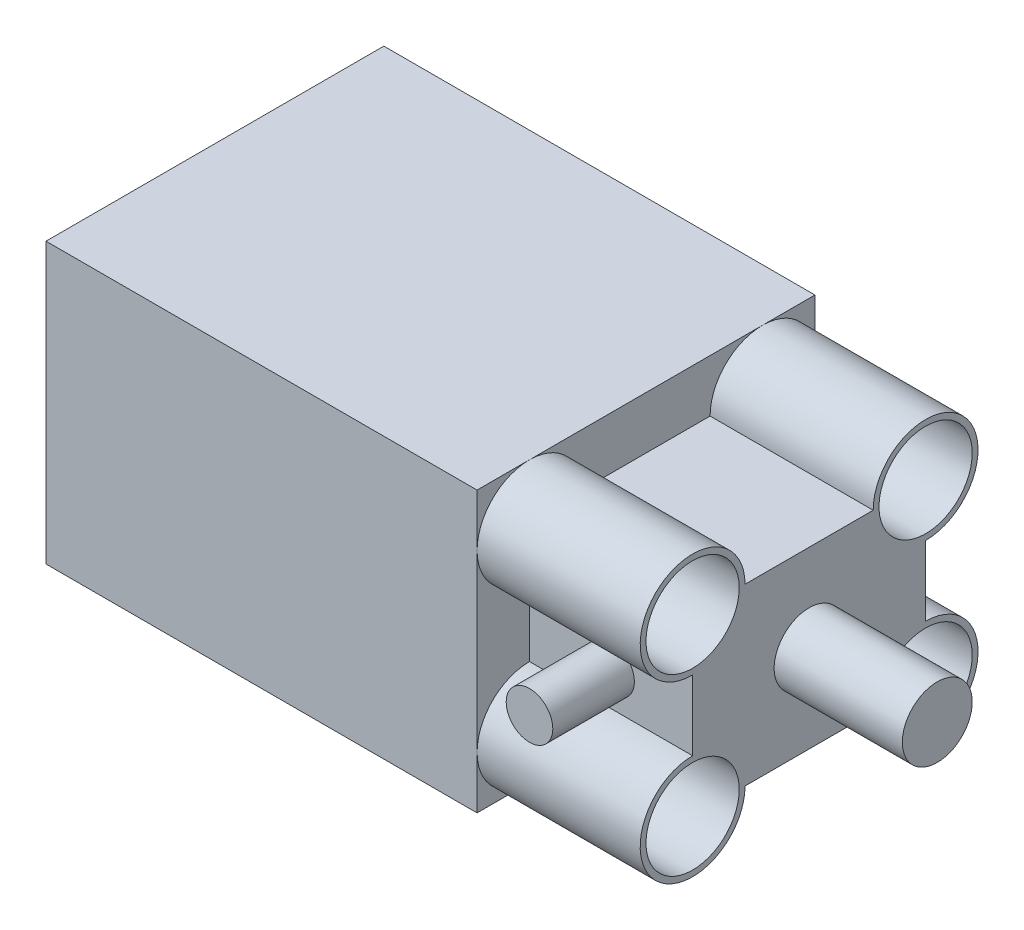
ISO-10303-21;
HEADER;
FILE_DESCRIPTION(('STEP AP214'),'2;1');
FILE_NAME('part.step','',(''),(''),'','','');
FILE_SCHEMA(('AUTOMOTIVE_DESIGN { 1 0 10303 214 1 1 1 1 }'));
ENDSEC;
DATA;
#1=APPLICATION_CONTEXT('core data for automotive mechanical design processes');
#2=APPLICATION_PROTOCOL_DEFINITION('international standard','automotive_design',2000,#1);
#3=PRODUCT_CONTEXT('',#1,'mechanical');
#4=PRODUCT('Part','Part','',(#3));
#5=PRODUCT_RELATED_PRODUCT_CATEGORY('part','',(#4));
#6=PRODUCT_DEFINITION_FORMATION('','',#4);
#7=PRODUCT_DEFINITION_CONTEXT('part definition',#1,'design');
#8=PRODUCT_DEFINITION('design','',#6,#7);
#9=PRODUCT_DEFINITION_SHAPE('','',#8);
#10=(LENGTH_UNIT() NAMED_UNIT(*) SI_UNIT(.MILLI.,.METRE.));
#11=(NAMED_UNIT(*) PLANE_ANGLE_UNIT() SI_UNIT($,.RADIAN.));
#12=(NAMED_UNIT(*) SI_UNIT($,.STERADIAN.) SOLID_ANGLE_UNIT());
#13=UNCERTAINTY_MEASURE_WITH_UNIT(LENGTH_MEASURE(1.E-05),#10,'distance_accuracy_value','');
#14=(GEOMETRIC_REPRESENTATION_CONTEXT(3) GLOBAL_UNCERTAINTY_ASSIGNED_CONTEXT((#13)) GLOBAL_UNIT_ASSIGNED_CONTEXT((#10,
#11,#12)) REPRESENTATION_CONTEXT('',''));
#15=CARTESIAN_POINT('',(0.,0.,0.));
#16=DIRECTION('',(0.,0.,1.));
#17=DIRECTION('',(1.,0.,0.));
#18=AXIS2_PLACEMENT_3D('',#15,#16,#17);
#19=CARTESIAN_POINT('',(9.25,12.,-7.25));
#20=DIRECTION('',(-1.,0.,0.));
#21=DIRECTION('',(0.,0.,1.));
#22=AXIS2_PLACEMENT_3D('',#19,#20,#21);
#23=PLANE('',#22);
#24=CARTESIAN_POINT('',(9.25,2.25,-5.));
#25=DIRECTION('',(1.,0.,0.));
#26=DIRECTION('',(0.,0.,-1.));
#27=AXIS2_PLACEMENT_3D('',#24,#25,#26);
#28=CIRCLE('',#27,2.25);
#29=CARTESIAN_POINT('',(9.25,2.25,-7.25));
#30=VERTEX_POINT('',#29);
#31=CARTESIAN_POINT('',(9.25,4.5,-5.));
#32=VERTEX_POINT('',#31);
#33=EDGE_CURVE('E45',#30,#32,#28,.T.);
#34=ORIENTED_EDGE('',*,*,#33,.F.);
#35=DIRECTION('',(0.,-1.,0.));
#36=VECTOR('',#35,1.);
#37=CARTESIAN_POINT('',(9.25,12.,-7.25));
#38=LINE('',#37,#36);
#39=CARTESIAN_POINT('',(9.25,9.75,-7.25));
#40=VERTEX_POINT('',#39);
#41=EDGE_CURVE('E216',#40,#30,#38,.T.);
#42=ORIENTED_EDGE('',*,*,#41,.F.);
#43=CARTESIAN_POINT('',(9.25,9.75,-5.));
#44=DIRECTION('',(1.,0.,0.));
#45=DIRECTION('',(0.,0.,-1.));
#46=AXIS2_PLACEMENT_3D('',#43,#44,#45);
#47=CIRCLE('',#46,2.25);
#48=CARTESIAN_POINT('',(9.25,7.5,-5.));
#49=VERTEX_POINT('',#48);
#50=EDGE_CURVE('E57',#49,#40,#47,.T.);
#51=ORIENTED_EDGE('',*,*,#50,.F.);
#52=DIRECTION('',(0.,-1.,0.));
#53=VECTOR('',#52,1.);
#54=CARTESIAN_POINT('',(9.25,0.,-5.));
#55=LINE('',#54,#53);
#56=EDGE_CURVE('E52',#49,#32,#55,.T.);
#57=ORIENTED_EDGE('',*,*,#56,.T.);
#58=EDGE_LOOP('',(#34,#42,#51,#57));
#59=FACE_BOUND('',#58,.T.);
#60=ADVANCED_FACE('F37',(#59),#23,.F.);
#61=CARTESIAN_POINT('',(9.25,0.,-5.));
#62=VERTEX_POINT('',#61);
#63=EDGE_CURVE('E364',#62,#30,#28,.T.);
#64=ORIENTED_EDGE('',*,*,#63,.F.);
#65=DIRECTION('',(0.,0.,-1.));
#66=VECTOR('',#65,1.);
#67=CARTESIAN_POINT('',(9.25,0.,-7.25));
#68=LINE('',#67,#66);
#69=CARTESIAN_POINT('',(9.25,0.,-7.25));
#70=VERTEX_POINT('',#69);
#71=EDGE_CURVE('E203',#62,#70,#68,.T.);
#72=ORIENTED_EDGE('',*,*,#71,.T.);
#73=EDGE_CURVE('E211',#30,#70,#38,.T.);
#74=ORIENTED_EDGE('',*,*,#73,.F.);
#75=EDGE_LOOP('',(#64,#72,#74));
#76=FACE_BOUND('',#75,.T.);
#77=ADVANCED_FACE('F294',(#76),#23,.F.);
#78=CARTESIAN_POINT('',(9.25,12.,-5.));
#79=VERTEX_POINT('',#78);
#80=EDGE_CURVE('E369',#40,#79,#47,.T.);
#81=ORIENTED_EDGE('',*,*,#80,.F.);
#82=CARTESIAN_POINT('',(9.25,12.,-7.25));
#83=VERTEX_POINT('',#82);
#84=EDGE_CURVE('E212',#83,#40,#38,.T.);
#85=ORIENTED_EDGE('',*,*,#84,.F.);
#86=DIRECTION('',(0.,0.,-1.));
#87=VECTOR('',#86,1.);
#88=CARTESIAN_POINT('',(9.25,12.,-7.25));
#89=LINE('',#88,#87);
#90=EDGE_CURVE('E193',#79,#83,#89,.T.);
#91=ORIENTED_EDGE('',*,*,#90,.F.);
#92=EDGE_LOOP('',(#81,#85,#91));
#93=FACE_BOUND('',#92,.T.);
#94=ADVANCED_FACE('F300',(#93),#23,.F.);
#95=CARTESIAN_POINT('',(9.25,9.75,-2.75));
#96=VERTEX_POINT('',#95);
#97=EDGE_CURVE('E356',#79,#96,#47,.T.);
#98=ORIENTED_EDGE('',*,*,#97,.F.);
#99=CARTESIAN_POINT('',(9.25,12.,5.));
#100=VERTEX_POINT('',#99);
#101=EDGE_CURVE('E198',#100,#79,#89,.T.);
#102=ORIENTED_EDGE('',*,*,#101,.F.);
#103=CARTESIAN_POINT('',(9.25,9.75,5.));
#104=DIRECTION('',(1.,0.,0.));
#105=DIRECTION('',(0.,0.,-1.));
#106=AXIS2_PLACEMENT_3D('',#103,#104,#105);
#107=CIRCLE('',#106,2.25);
#108=CARTESIAN_POINT('',(9.25,9.75,2.75));
#109=VERTEX_POINT('',#108);
#110=EDGE_CURVE('E226',#109,#100,#107,.T.);
#111=ORIENTED_EDGE('',*,*,#110,.F.);
#112=DIRECTION('',(0.,0.,-1.));
#113=VECTOR('',#112,1.);
#114=CARTESIAN_POINT('',(9.25,9.75,0.));
#115=LINE('',#114,#113);
#116=EDGE_CURVE('E368',#109,#96,#115,.T.);
#117=ORIENTED_EDGE('',*,*,#116,.T.);
#118=EDGE_LOOP('',(#98,#102,#111,#117));
#119=FACE_BOUND('',#118,.T.);
#120=ADVANCED_FACE('F409',(#119),#23,.F.);
#121=CARTESIAN_POINT('',(9.25,2.25,-2.75));
#122=VERTEX_POINT('',#121);
#123=EDGE_CURVE('E359',#122,#62,#28,.T.);
#124=ORIENTED_EDGE('',*,*,#123,.F.);
#125=DIRECTION('',(0.,0.,1.));
#126=VECTOR('',#125,1.);
#127=CARTESIAN_POINT('',(9.25,2.25,0.));
#128=LINE('',#127,#126);
#129=CARTESIAN_POINT('',(9.25,2.25,2.75));
#130=VERTEX_POINT('',#129);
#131=EDGE_CURVE('E358',#122,#130,#128,.T.);
#132=ORIENTED_EDGE('',*,*,#131,.T.);
#133=CARTESIAN_POINT('',(9.25,2.25,5.));
#134=DIRECTION('',(1.,0.,0.));
#135=DIRECTION('',(0.,0.,-1.));
#136=AXIS2_PLACEMENT_3D('',#133,#134,#135);
#137=CIRCLE('',#136,2.25);
#138=CARTESIAN_POINT('',(9.25,0.,5.));
#139=VERTEX_POINT('',#138);
#140=EDGE_CURVE('E353',#139,#130,#137,.T.);
#141=ORIENTED_EDGE('',*,*,#140,.F.);
#142=EDGE_CURVE('E207',#139,#62,#68,.T.);
#143=ORIENTED_EDGE('',*,*,#142,.T.);
#144=EDGE_LOOP('',(#124,#132,#141,#143));
#145=FACE_BOUND('',#144,.T.);
#146=ADVANCED_FACE('F416',(#145),#23,.F.);
#147=CARTESIAN_POINT('',(9.25,2.25,7.25));
#148=VERTEX_POINT('',#147);
#149=EDGE_CURVE('E227',#148,#139,#137,.T.);
#150=ORIENTED_EDGE('',*,*,#149,.F.);
#151=DIRECTION('',(0.,-1.,0.));
#152=VECTOR('',#151,1.);
#153=CARTESIAN_POINT('',(9.25,12.,7.25));
#154=LINE('',#153,#152);
#155=CARTESIAN_POINT('',(9.25,0.,7.25));
#156=VERTEX_POINT('',#155);
#157=EDGE_CURVE('E215',#148,#156,#154,.T.);
#158=ORIENTED_EDGE('',*,*,#157,.T.);
#159=EDGE_CURVE('E204',#156,#139,#68,.T.);
#160=ORIENTED_EDGE('',*,*,#159,.T.);
#161=EDGE_LOOP('',(#150,#158,#160));
#162=FACE_BOUND('',#161,.T.);
#163=ADVANCED_FACE('F350',(#162),#23,.F.);
#164=CARTESIAN_POINT('',(9.25,9.75,7.25));
#165=VERTEX_POINT('',#164);
#166=EDGE_CURVE('E224',#100,#165,#107,.T.);
#167=ORIENTED_EDGE('',*,*,#166,.F.);
#168=CARTESIAN_POINT('',(9.25,12.,7.25));
#169=VERTEX_POINT('',#168);
#170=EDGE_CURVE('E194',#169,#100,#89,.T.);
#171=ORIENTED_EDGE('',*,*,#170,.F.);
#172=EDGE_CURVE('E217',#169,#165,#154,.T.);
#173=ORIENTED_EDGE('',*,*,#172,.T.);
#174=EDGE_LOOP('',(#167,#171,#173));
#175=FACE_BOUND('',#174,.T.);
#176=ADVANCED_FACE('F315',(#175),#23,.F.);
#177=CARTESIAN_POINT('',(-9.25,12.,-7.25));
#178=DIRECTION('',(1.,0.,0.));
#179=DIRECTION('',(0.,0.,-1.));
#180=AXIS2_PLACEMENT_3D('',#177,#178,#179);
#181=PLANE('',#180);
#182=DIRECTION('',(0.,0.,1.));
#183=VECTOR('',#182,1.);
#184=CARTESIAN_POINT('',(-9.25,0.,-7.25));
#185=LINE('',#184,#183);
#186=CARTESIAN_POINT('',(-9.25,0.,-7.25));
#187=VERTEX_POINT('',#186);
#188=CARTESIAN_POINT('',(-9.25,0.,7.25));
#189=VERTEX_POINT('',#188);
#190=EDGE_CURVE('E178',#187,#189,#185,.T.);
#191=ORIENTED_EDGE('',*,*,#190,.T.);
#192=DIRECTION('',(0.,-1.,0.));
#193=VECTOR('',#192,1.);
#194=CARTESIAN_POINT('',(-9.25,12.,7.25));
#195=LINE('',#194,#193);
#196=CARTESIAN_POINT('',(-9.25,12.,7.25));
#197=VERTEX_POINT('',#196);
#198=EDGE_CURVE('E219',#197,#189,#195,.T.);
#199=ORIENTED_EDGE('',*,*,#198,.F.);
#200=DIRECTION('',(0.,0.,1.));
#201=VECTOR('',#200,1.);
#202=CARTESIAN_POINT('',(-9.25,12.,-7.25));
#203=LINE('',#202,#201);
#204=CARTESIAN_POINT('',(-9.25,12.,-7.25));
#205=VERTEX_POINT('',#204);
#206=EDGE_CURVE('E187',#205,#197,#203,.T.);
#207=ORIENTED_EDGE('',*,*,#206,.F.);
#208=DIRECTION('',(0.,-1.,0.));
#209=VECTOR('',#208,1.);
#210=CARTESIAN_POINT('',(-9.25,12.,-7.25));
#211=LINE('',#210,#209);
#212=EDGE_CURVE('E199',#205,#187,#211,.T.);
#213=ORIENTED_EDGE('',*,*,#212,.T.);
#214=EDGE_LOOP('',(#191,#199,#207,#213));
#215=FACE_BOUND('',#214,.T.);
#216=ADVANCED_FACE('F39',(#215),#181,.F.);
#217=CARTESIAN_POINT('',(9.25,12.,7.25));
#218=DIRECTION('',(0.,0.,-1.));
#219=DIRECTION('',(-1.,0.,0.));
#220=AXIS2_PLACEMENT_3D('',#217,#218,#219);
#221=PLANE('',#220);
#222=DIRECTION('',(1.,0.,0.));
#223=VECTOR('',#222,1.);
#224=CARTESIAN_POINT('',(9.25,0.,7.25));
#225=LINE('',#224,#223);
#226=EDGE_CURVE('E181',#189,#156,#225,.T.);
#227=ORIENTED_EDGE('',*,*,#226,.T.);
#228=ORIENTED_EDGE('',*,*,#157,.F.);
#229=EDGE_CURVE('E220',#165,#148,#154,.T.);
#230=ORIENTED_EDGE('',*,*,#229,.F.);
#231=ORIENTED_EDGE('',*,*,#172,.F.);
#232=DIRECTION('',(1.,0.,0.));
#233=VECTOR('',#232,1.);
#234=CARTESIAN_POINT('',(9.25,12.,7.25));
#235=LINE('',#234,#233);
#236=EDGE_CURVE('E190',#197,#169,#235,.T.);
#237=ORIENTED_EDGE('',*,*,#236,.F.);
#238=ORIENTED_EDGE('',*,*,#198,.T.);
#239=EDGE_LOOP('',(#227,#228,#230,#231,#237,#238));
#240=FACE_BOUND('',#239,.T.);
#241=ADVANCED_FACE('F318',(#240),#221,.F.);
#242=CARTESIAN_POINT('',(9.25,7.5,5.));
#243=VERTEX_POINT('',#242);
#244=EDGE_CURVE('E177',#165,#243,#107,.T.);
#245=ORIENTED_EDGE('',*,*,#244,.F.);
#246=ORIENTED_EDGE('',*,*,#229,.T.);
#247=CARTESIAN_POINT('',(9.25,4.5,5.));
#248=VERTEX_POINT('',#247);
#249=EDGE_CURVE('E232',#248,#148,#137,.T.);
#250=ORIENTED_EDGE('',*,*,#249,.F.);
#251=DIRECTION('',(0.,-1.,0.));
#252=VECTOR('',#251,1.);
#253=CARTESIAN_POINT('',(9.25,0.,5.));
#254=LINE('',#253,#252);
#255=EDGE_CURVE('E230',#243,#248,#254,.T.);
#256=ORIENTED_EDGE('',*,*,#255,.F.);
#257=EDGE_LOOP('',(#245,#246,#250,#256));
#258=FACE_BOUND('',#257,.T.);
#259=ADVANCED_FACE('F302',(#258),#23,.F.);
#260=CARTESIAN_POINT('',(9.25,12.,-7.25));
#261=DIRECTION('',(0.,0.,1.));
#262=DIRECTION('',(1.,0.,0.));
#263=AXIS2_PLACEMENT_3D('',#260,#261,#262);
#264=PLANE('',#263);
#265=DIRECTION('',(-1.,0.,0.));
#266=VECTOR('',#265,1.);
#267=CARTESIAN_POINT('',(9.25,0.,-7.25));
#268=LINE('',#267,#266);
#269=EDGE_CURVE('E191',#70,#187,#268,.T.);
#270=ORIENTED_EDGE('',*,*,#269,.T.);
#271=ORIENTED_EDGE('',*,*,#212,.F.);
#272=DIRECTION('',(-1.,0.,0.));
#273=VECTOR('',#272,1.);
#274=CARTESIAN_POINT('',(9.25,12.,-7.25));
#275=LINE('',#274,#273);
#276=EDGE_CURVE('E197',#83,#205,#275,.T.);
#277=ORIENTED_EDGE('',*,*,#276,.F.);
#278=ORIENTED_EDGE('',*,*,#84,.T.);
#279=ORIENTED_EDGE('',*,*,#41,.T.);
#280=ORIENTED_EDGE('',*,*,#73,.T.);
#281=EDGE_LOOP('',(#270,#271,#277,#278,#279,#280));
#282=FACE_BOUND('',#281,.T.);
#283=ADVANCED_FACE('F317',(#282),#264,.F.);
#284=CARTESIAN_POINT('',(0.,12.,0.));
#285=DIRECTION('',(0.,-1.,0.));
#286=DIRECTION('',(0.,0.,-1.));
#287=AXIS2_PLACEMENT_3D('',#284,#285,#286);
#288=PLANE('',#287);
#289=ORIENTED_EDGE('',*,*,#206,.T.);
#290=ORIENTED_EDGE('',*,*,#236,.T.);
#291=ORIENTED_EDGE('',*,*,#170,.T.);
#292=ORIENTED_EDGE('',*,*,#101,.T.);
#293=ORIENTED_EDGE('',*,*,#90,.T.);
#294=ORIENTED_EDGE('',*,*,#276,.T.);
#295=EDGE_LOOP('',(#289,#290,#291,#292,#293,#294));
#296=FACE_BOUND('',#295,.T.);
#297=ADVANCED_FACE('F324',(#296),#288,.F.);
#298=CARTESIAN_POINT('',(0.,0.,0.));
#299=DIRECTION('',(0.,-1.,0.));
#300=DIRECTION('',(0.,0.,-1.));
#301=AXIS2_PLACEMENT_3D('',#298,#299,#300);
#302=PLANE('',#301);
#303=ORIENTED_EDGE('',*,*,#190,.F.);
#304=ORIENTED_EDGE('',*,*,#269,.F.);
#305=ORIENTED_EDGE('',*,*,#71,.F.);
#306=ORIENTED_EDGE('',*,*,#142,.F.);
#307=ORIENTED_EDGE('',*,*,#159,.F.);
#308=ORIENTED_EDGE('',*,*,#226,.F.);
#309=EDGE_LOOP('',(#303,#304,#305,#306,#307,#308));
#310=FACE_BOUND('',#309,.T.);
#311=ADVANCED_FACE('F291',(#310),#302,.T.);
#312=CARTESIAN_POINT('',(16.25,9.75,5.));
#313=DIRECTION('',(-1.,0.,0.));
#314=DIRECTION('',(0.,0.,1.));
#315=AXIS2_PLACEMENT_3D('',#312,#313,#314);
#316=CYLINDRICAL_SURFACE('',#315,2.25);
#317=ORIENTED_EDGE('',*,*,#110,.T.);
#318=ORIENTED_EDGE('',*,*,#166,.T.);
#319=ORIENTED_EDGE('',*,*,#244,.T.);
#320=DIRECTION('',(-1.,0.,0.));
#321=VECTOR('',#320,1.);
#322=CARTESIAN_POINT('',(16.25,7.5,5.));
#323=LINE('',#322,#321);
#324=CARTESIAN_POINT('',(16.25,7.5,5.));
#325=VERTEX_POINT('',#324);
#326=EDGE_CURVE('E155',#325,#243,#323,.T.);
#327=ORIENTED_EDGE('',*,*,#326,.F.);
#328=CARTESIAN_POINT('',(16.25,9.75,5.));
#329=DIRECTION('',(1.,0.,0.));
#330=DIRECTION('',(0.,0.,-1.));
#331=AXIS2_PLACEMENT_3D('',#328,#329,#330);
#332=CIRCLE('',#331,2.25);
#333=CARTESIAN_POINT('',(16.25,9.75,2.75));
#334=VERTEX_POINT('',#333);
#335=EDGE_CURVE('E161',#334,#325,#332,.T.);
#336=ORIENTED_EDGE('',*,*,#335,.F.);
#337=DIRECTION('',(-1.,0.,0.));
#338=VECTOR('',#337,1.);
#339=CARTESIAN_POINT('',(16.25,9.75,2.75));
#340=LINE('',#339,#338);
#341=EDGE_CURVE('E244',#334,#109,#340,.T.);
#342=ORIENTED_EDGE('',*,*,#341,.T.);
#343=EDGE_LOOP('',(#317,#318,#319,#327,#336,#342));
#344=FACE_BOUND('',#343,.T.);
#345=ADVANCED_FACE('F175',(#344),#316,.T.);
#346=CARTESIAN_POINT('',(16.25,0.,5.));
#347=DIRECTION('',(0.,0.,-1.));
#348=DIRECTION('',(-1.,0.,0.));
#349=AXIS2_PLACEMENT_3D('',#346,#347,#348);
#350=PLANE('',#349);
#351=CARTESIAN_POINT('',(12.75,6.,5.));
#352=DIRECTION('',(0.,0.,-1.));
#353=DIRECTION('',(-1.,0.,0.));
#354=AXIS2_PLACEMENT_3D('',#351,#352,#353);
#355=CIRCLE('',#354,1.);
#356=CARTESIAN_POINT('',(11.75,6.,5.));
#357=VERTEX_POINT('',#356);
#358=EDGE_CURVE('E11',#357,#357,#355,.F.);
#359=ORIENTED_EDGE('',*,*,#358,.F.);
#360=EDGE_LOOP('',(#359));
#361=FACE_BOUND('',#360,.T.);
#362=ORIENTED_EDGE('',*,*,#255,.T.);
#363=DIRECTION('',(-1.,0.,0.));
#364=VECTOR('',#363,1.);
#365=CARTESIAN_POINT('',(16.25,4.5,5.));
#366=LINE('',#365,#364);
#367=CARTESIAN_POINT('',(16.25,4.5,5.));
#368=VERTEX_POINT('',#367);
#369=EDGE_CURVE('E157',#368,#248,#366,.T.);
#370=ORIENTED_EDGE('',*,*,#369,.F.);
#371=DIRECTION('',(0.,-1.,0.));
#372=VECTOR('',#371,1.);
#373=CARTESIAN_POINT('',(16.25,0.,5.));
#374=LINE('',#373,#372);
#375=EDGE_CURVE('E150',#325,#368,#374,.T.);
#376=ORIENTED_EDGE('',*,*,#375,.F.);
#377=ORIENTED_EDGE('',*,*,#326,.T.);
#378=EDGE_LOOP('',(#362,#370,#376,#377));
#379=FACE_BOUND('',#378,.T.);
#380=ADVANCED_FACE('F153',(#361,#379),#350,.F.);
#381=CARTESIAN_POINT('',(16.25,2.25,5.));
#382=DIRECTION('',(-1.,0.,0.));
#383=DIRECTION('',(0.,0.,1.));
#384=AXIS2_PLACEMENT_3D('',#381,#382,#383);
#385=CYLINDRICAL_SURFACE('',#384,2.25);
#386=ORIENTED_EDGE('',*,*,#249,.T.);
#387=ORIENTED_EDGE('',*,*,#149,.T.);
#388=ORIENTED_EDGE('',*,*,#140,.T.);
#389=DIRECTION('',(-1.,0.,0.));
#390=VECTOR('',#389,1.);
#391=CARTESIAN_POINT('',(16.25,2.25,2.75));
#392=LINE('',#391,#390);
#393=CARTESIAN_POINT('',(16.25,2.25,2.75));
#394=VERTEX_POINT('',#393);
#395=EDGE_CURVE('E183',#394,#130,#392,.T.);
#396=ORIENTED_EDGE('',*,*,#395,.F.);
#397=CARTESIAN_POINT('',(16.25,2.25,5.));
#398=DIRECTION('',(1.,0.,0.));
#399=DIRECTION('',(0.,0.,-1.));
#400=AXIS2_PLACEMENT_3D('',#397,#398,#399);
#401=CIRCLE('',#400,2.25);
#402=EDGE_CURVE('E160',#368,#394,#401,.T.);
#403=ORIENTED_EDGE('',*,*,#402,.F.);
#404=ORIENTED_EDGE('',*,*,#369,.T.);
#405=EDGE_LOOP('',(#386,#387,#388,#396,#403,#404));
#406=FACE_BOUND('',#405,.T.);
#407=ADVANCED_FACE('F282',(#406),#385,.T.);
#408=CARTESIAN_POINT('',(16.25,2.25,0.));
#409=DIRECTION('',(0.,-1.,0.));
#410=DIRECTION('',(0.,0.,-1.));
#411=AXIS2_PLACEMENT_3D('',#408,#409,#410);
#412=PLANE('',#411);
#413=ORIENTED_EDGE('',*,*,#131,.F.);
#414=DIRECTION('',(-1.,0.,0.));
#415=VECTOR('',#414,1.);
#416=CARTESIAN_POINT('',(16.25,2.25,-2.75));
#417=LINE('',#416,#415);
#418=CARTESIAN_POINT('',(16.25,2.25,-2.75));
#419=VERTEX_POINT('',#418);
#420=EDGE_CURVE('E388',#419,#122,#417,.T.);
#421=ORIENTED_EDGE('',*,*,#420,.F.);
#422=DIRECTION('',(0.,0.,1.));
#423=VECTOR('',#422,1.);
#424=CARTESIAN_POINT('',(16.25,2.25,0.));
#425=LINE('',#424,#423);
#426=EDGE_CURVE('E259',#419,#394,#425,.T.);
#427=ORIENTED_EDGE('',*,*,#426,.T.);
#428=ORIENTED_EDGE('',*,*,#395,.T.);
#429=EDGE_LOOP('',(#413,#421,#427,#428));
#430=FACE_BOUND('',#429,.T.);
#431=ADVANCED_FACE('F288',(#430),#412,.T.);
#432=CARTESIAN_POINT('',(16.25,2.25,-5.));
#433=DIRECTION('',(-1.,0.,0.));
#434=DIRECTION('',(0.,0.,1.));
#435=AXIS2_PLACEMENT_3D('',#432,#433,#434);
#436=CYLINDRICAL_SURFACE('',#435,2.25);
#437=ORIENTED_EDGE('',*,*,#123,.T.);
#438=ORIENTED_EDGE('',*,*,#63,.T.);
#439=ORIENTED_EDGE('',*,*,#33,.T.);
#440=DIRECTION('',(-1.,0.,0.));
#441=VECTOR('',#440,1.);
#442=CARTESIAN_POINT('',(16.25,4.5,-5.));
#443=LINE('',#442,#441);
#444=CARTESIAN_POINT('',(16.25,4.5,-5.));
#445=VERTEX_POINT('',#444);
#446=EDGE_CURVE('E385',#445,#32,#443,.T.);
#447=ORIENTED_EDGE('',*,*,#446,.F.);
#448=CARTESIAN_POINT('',(16.25,2.25,-5.));
#449=DIRECTION('',(1.,0.,0.));
#450=DIRECTION('',(0.,0.,-1.));
#451=AXIS2_PLACEMENT_3D('',#448,#449,#450);
#452=CIRCLE('',#451,2.25);
#453=EDGE_CURVE('E257',#419,#445,#452,.T.);
#454=ORIENTED_EDGE('',*,*,#453,.F.);
#455=ORIENTED_EDGE('',*,*,#420,.T.);
#456=EDGE_LOOP('',(#437,#438,#439,#447,#454,#455));
#457=FACE_BOUND('',#456,.T.);
#458=ADVANCED_FACE('F396',(#457),#436,.T.);
#459=CARTESIAN_POINT('',(16.25,0.,-5.));
#460=DIRECTION('',(0.,0.,-1.));
#461=DIRECTION('',(0.,1.,0.));
#462=AXIS2_PLACEMENT_3D('',#459,#460,#461);
#463=PLANE('',#462);
#464=ORIENTED_EDGE('',*,*,#56,.F.);
#465=DIRECTION('',(-1.,0.,0.));
#466=VECTOR('',#465,1.);
#467=CARTESIAN_POINT('',(16.25,7.5,-5.));
#468=LINE('',#467,#466);
#469=CARTESIAN_POINT('',(16.25,7.5,-5.));
#470=VERTEX_POINT('',#469);
#471=EDGE_CURVE('E383',#470,#49,#468,.T.);
#472=ORIENTED_EDGE('',*,*,#471,.F.);
#473=DIRECTION('',(0.,-1.,0.));
#474=VECTOR('',#473,1.);
#475=CARTESIAN_POINT('',(16.25,0.,-5.));
#476=LINE('',#475,#474);
#477=EDGE_CURVE('E254',#470,#445,#476,.T.);
#478=ORIENTED_EDGE('',*,*,#477,.T.);
#479=ORIENTED_EDGE('',*,*,#446,.T.);
#480=EDGE_LOOP('',(#464,#472,#478,#479));
#481=FACE_BOUND('',#480,.T.);
#482=ADVANCED_FACE('F399',(#481),#463,.T.);
#483=CARTESIAN_POINT('',(16.25,9.75,-5.));
#484=DIRECTION('',(-1.,0.,0.));
#485=DIRECTION('',(0.,0.,1.));
#486=AXIS2_PLACEMENT_3D('',#483,#484,#485);
#487=CYLINDRICAL_SURFACE('',#486,2.25);
#488=ORIENTED_EDGE('',*,*,#50,.T.);
#489=ORIENTED_EDGE('',*,*,#80,.T.);
#490=ORIENTED_EDGE('',*,*,#97,.T.);
#491=DIRECTION('',(-1.,0.,0.));
#492=VECTOR('',#491,1.);
#493=CARTESIAN_POINT('',(16.25,9.75,-2.75));
#494=LINE('',#493,#492);
#495=CARTESIAN_POINT('',(16.25,9.75,-2.75));
#496=VERTEX_POINT('',#495);
#497=EDGE_CURVE('E380',#496,#96,#494,.T.);
#498=ORIENTED_EDGE('',*,*,#497,.F.);
#499=CARTESIAN_POINT('',(16.25,9.75,-5.));
#500=DIRECTION('',(1.,0.,0.));
#501=DIRECTION('',(0.,0.,-1.));
#502=AXIS2_PLACEMENT_3D('',#499,#500,#501);
#503=CIRCLE('',#502,2.25);
#504=EDGE_CURVE('E252',#470,#496,#503,.T.);
#505=ORIENTED_EDGE('',*,*,#504,.F.);
#506=ORIENTED_EDGE('',*,*,#471,.T.);
#507=EDGE_LOOP('',(#488,#489,#490,#498,#505,#506));
#508=FACE_BOUND('',#507,.T.);
#509=ADVANCED_FACE('F403',(#508),#487,.T.);
#510=CARTESIAN_POINT('',(16.25,2.25,-5.));
#511=DIRECTION('',(-1.,0.,0.));
#512=DIRECTION('',(0.,0.,1.));
#513=AXIS2_PLACEMENT_3D('',#510,#511,#512);
#514=CYLINDRICAL_SURFACE('',#513,2.);
#515=CARTESIAN_POINT('',(16.25,2.25,-5.));
#516=DIRECTION('',(1.,0.,0.));
#517=DIRECTION('',(0.,0.,-1.));
#518=AXIS2_PLACEMENT_3D('',#515,#516,#517);
#519=CIRCLE('',#518,2.);
#520=CARTESIAN_POINT('',(16.25,2.25,-7.));
#521=VERTEX_POINT('',#520);
#522=EDGE_CURVE('E245',#521,#521,#519,.T.);
#523=ORIENTED_EDGE('',*,*,#522,.T.);
#524=EDGE_LOOP('',(#523));
#525=FACE_BOUND('',#524,.T.);
#526=CARTESIAN_POINT('',(9.25,2.25,-5.));
#527=DIRECTION('',(1.,0.,0.));
#528=DIRECTION('',(0.,0.,-1.));
#529=AXIS2_PLACEMENT_3D('',#526,#527,#528);
#530=CIRCLE('',#529,2.);
#531=CARTESIAN_POINT('',(9.25,2.25,-7.));
#532=VERTEX_POINT('',#531);
#533=EDGE_CURVE('E374',#532,#532,#530,.T.);
#534=ORIENTED_EDGE('',*,*,#533,.F.);
#535=EDGE_LOOP('',(#534));
#536=FACE_BOUND('',#535,.T.);
#537=ADVANCED_FACE('F528',(#525,#536),#514,.F.);
#538=CARTESIAN_POINT('',(16.25,9.75,-5.));
#539=DIRECTION('',(-1.,0.,0.));
#540=DIRECTION('',(0.,0.,1.));
#541=AXIS2_PLACEMENT_3D('',#538,#539,#540);
#542=CYLINDRICAL_SURFACE('',#541,2.);
#543=CARTESIAN_POINT('',(16.25,9.75,-5.));
#544=DIRECTION('',(1.,0.,0.));
#545=DIRECTION('',(0.,0.,-1.));
#546=AXIS2_PLACEMENT_3D('',#543,#544,#545);
#547=CIRCLE('',#546,2.);
#548=CARTESIAN_POINT('',(16.25,9.75,-7.));
#549=VERTEX_POINT('',#548);
#550=EDGE_CURVE('E248',#549,#549,#547,.T.);
#551=ORIENTED_EDGE('',*,*,#550,.T.);
#552=EDGE_LOOP('',(#551));
#553=FACE_BOUND('',#552,.T.);
#554=CARTESIAN_POINT('',(9.25,9.75,-5.));
#555=DIRECTION('',(1.,0.,0.));
#556=DIRECTION('',(0.,0.,-1.));
#557=AXIS2_PLACEMENT_3D('',#554,#555,#556);
#558=CIRCLE('',#557,2.);
#559=CARTESIAN_POINT('',(9.25,9.75,-7.));
#560=VERTEX_POINT('',#559);
#561=EDGE_CURVE('E371',#560,#560,#558,.T.);
#562=ORIENTED_EDGE('',*,*,#561,.F.);
#563=EDGE_LOOP('',(#562));
#564=FACE_BOUND('',#563,.T.);
#565=ADVANCED_FACE('F537',(#553,#564),#542,.F.);
#566=CARTESIAN_POINT('',(16.25,9.75,0.));
#567=DIRECTION('',(0.,1.,0.));
#568=DIRECTION('',(0.,0.,1.));
#569=AXIS2_PLACEMENT_3D('',#566,#567,#568);
#570=PLANE('',#569);
#571=ORIENTED_EDGE('',*,*,#116,.F.);
#572=ORIENTED_EDGE('',*,*,#341,.F.);
#573=DIRECTION('',(0.,0.,-1.));
#574=VECTOR('',#573,1.);
#575=CARTESIAN_POINT('',(16.25,9.75,0.));
#576=LINE('',#575,#574);
#577=EDGE_CURVE('E168',#334,#496,#576,.T.);
#578=ORIENTED_EDGE('',*,*,#577,.T.);
#579=ORIENTED_EDGE('',*,*,#497,.T.);
#580=EDGE_LOOP('',(#571,#572,#578,#579));
#581=FACE_BOUND('',#580,.T.);
#582=ADVANCED_FACE('F407',(#581),#570,.T.);
#583=CARTESIAN_POINT('',(16.25,9.75,5.));
#584=DIRECTION('',(-1.,0.,0.));
#585=DIRECTION('',(0.,0.,1.));
#586=AXIS2_PLACEMENT_3D('',#583,#584,#585);
#587=CYLINDRICAL_SURFACE('',#586,2.);
#588=CARTESIAN_POINT('',(16.25,9.75,5.));
#589=DIRECTION('',(1.,0.,0.));
#590=DIRECTION('',(0.,0.,-1.));
#591=AXIS2_PLACEMENT_3D('',#588,#589,#590);
#592=CIRCLE('',#591,2.);
#593=CARTESIAN_POINT('',(16.25,9.75,3.));
#594=VERTEX_POINT('',#593);
#595=EDGE_CURVE('E171',#594,#594,#592,.T.);
#596=ORIENTED_EDGE('',*,*,#595,.T.);
#597=EDGE_LOOP('',(#596));
#598=FACE_BOUND('',#597,.T.);
#599=CARTESIAN_POINT('',(9.25,9.75,5.));
#600=DIRECTION('',(1.,0.,0.));
#601=DIRECTION('',(0.,0.,-1.));
#602=AXIS2_PLACEMENT_3D('',#599,#600,#601);
#603=CIRCLE('',#602,2.);
#604=CARTESIAN_POINT('',(9.25,9.75,3.));
#605=VERTEX_POINT('',#604);
#606=EDGE_CURVE('E231',#605,#605,#603,.T.);
#607=ORIENTED_EDGE('',*,*,#606,.F.);
#608=EDGE_LOOP('',(#607));
#609=FACE_BOUND('',#608,.T.);
#610=ADVANCED_FACE('F556',(#598,#609),#587,.F.);
#611=CARTESIAN_POINT('',(16.25,2.25,5.));
#612=DIRECTION('',(-1.,0.,0.));
#613=DIRECTION('',(0.,0.,1.));
#614=AXIS2_PLACEMENT_3D('',#611,#612,#613);
#615=CYLINDRICAL_SURFACE('',#614,2.);
#616=CARTESIAN_POINT('',(16.25,2.25,5.));
#617=DIRECTION('',(1.,0.,0.));
#618=DIRECTION('',(0.,0.,-1.));
#619=AXIS2_PLACEMENT_3D('',#616,#617,#618);
#620=CIRCLE('',#619,2.);
#621=CARTESIAN_POINT('',(16.25,2.25,3.));
#622=VERTEX_POINT('',#621);
#623=EDGE_CURVE('E241',#622,#622,#620,.T.);
#624=ORIENTED_EDGE('',*,*,#623,.T.);
#625=EDGE_LOOP('',(#624));
#626=FACE_BOUND('',#625,.T.);
#627=CARTESIAN_POINT('',(9.25,2.25,5.));
#628=DIRECTION('',(1.,0.,0.));
#629=DIRECTION('',(0.,0.,-1.));
#630=AXIS2_PLACEMENT_3D('',#627,#628,#629);
#631=CIRCLE('',#630,2.);
#632=CARTESIAN_POINT('',(9.25,2.25,3.));
#633=VERTEX_POINT('',#632);
#634=EDGE_CURVE('E265',#633,#633,#631,.T.);
#635=ORIENTED_EDGE('',*,*,#634,.F.);
#636=EDGE_LOOP('',(#635));
#637=FACE_BOUND('',#636,.T.);
#638=ADVANCED_FACE('F565',(#626,#637),#615,.F.);
#639=CARTESIAN_POINT('',(16.25,0.,0.));
#640=DIRECTION('',(1.,0.,0.));
#641=DIRECTION('',(0.,0.,-1.));
#642=AXIS2_PLACEMENT_3D('',#639,#640,#641);
#643=PLANE('',#642);
#644=CARTESIAN_POINT('',(16.25,6.,0.));
#645=DIRECTION('',(1.,0.,0.));
#646=DIRECTION('',(0.,0.,-1.));
#647=AXIS2_PLACEMENT_3D('',#644,#645,#646);
#648=CIRCLE('',#647,1.5);
#649=CARTESIAN_POINT('',(16.25,6.,-1.5));
#650=VERTEX_POINT('',#649);
#651=EDGE_CURVE('E238',#650,#650,#648,.T.);
#652=ORIENTED_EDGE('',*,*,#651,.F.);
#653=EDGE_LOOP('',(#652));
#654=FACE_BOUND('',#653,.T.);
#655=ORIENTED_EDGE('',*,*,#595,.F.);
#656=EDGE_LOOP('',(#655));
#657=FACE_BOUND('',#656,.T.);
#658=ORIENTED_EDGE('',*,*,#335,.T.);
#659=ORIENTED_EDGE('',*,*,#375,.T.);
#660=ORIENTED_EDGE('',*,*,#402,.T.);
#661=ORIENTED_EDGE('',*,*,#426,.F.);
#662=ORIENTED_EDGE('',*,*,#453,.T.);
#663=ORIENTED_EDGE('',*,*,#477,.F.);
#664=ORIENTED_EDGE('',*,*,#504,.T.);
#665=ORIENTED_EDGE('',*,*,#577,.F.);
#666=EDGE_LOOP('',(#658,#659,#660,#661,#662,#663,#664,#665));
#667=FACE_BOUND('',#666,.T.);
#668=ORIENTED_EDGE('',*,*,#550,.F.);
#669=EDGE_LOOP('',(#668));
#670=FACE_BOUND('',#669,.T.);
#671=ORIENTED_EDGE('',*,*,#522,.F.);
#672=EDGE_LOOP('',(#671));
#673=FACE_BOUND('',#672,.T.);
#674=ORIENTED_EDGE('',*,*,#623,.F.);
#675=EDGE_LOOP('',(#674));
#676=FACE_BOUND('',#675,.T.);
#677=ADVANCED_FACE('F165',(#654,#657,#667,#670,#673,#676),#643,.T.);
#678=ORIENTED_EDGE('',*,*,#533,.T.);
#679=EDGE_LOOP('',(#678));
#680=FACE_BOUND('',#679,.T.);
#681=ADVANCED_FACE('F313',(#680),#23,.F.);
#682=ORIENTED_EDGE('',*,*,#561,.T.);
#683=EDGE_LOOP('',(#682));
#684=FACE_BOUND('',#683,.T.);
#685=ADVANCED_FACE('F306',(#684),#23,.F.);
#686=ORIENTED_EDGE('',*,*,#606,.T.);
#687=EDGE_LOOP('',(#686));
#688=FACE_BOUND('',#687,.T.);
#689=ADVANCED_FACE('F296',(#688),#23,.F.);
#690=ORIENTED_EDGE('',*,*,#634,.T.);
#691=EDGE_LOOP('',(#690));
#692=FACE_BOUND('',#691,.T.);
#693=ADVANCED_FACE('F305',(#692),#23,.F.);
#694=CARTESIAN_POINT('',(21.75,6.,0.));
#695=DIRECTION('',(-1.,0.,0.));
#696=DIRECTION('',(0.,0.,1.));
#697=AXIS2_PLACEMENT_3D('',#694,#695,#696);
#698=CYLINDRICAL_SURFACE('',#697,1.5);
#699=CARTESIAN_POINT('',(21.75,6.,0.));
#700=DIRECTION('',(1.,0.,0.));
#701=DIRECTION('',(0.,0.,-1.));
#702=AXIS2_PLACEMENT_3D('',#699,#700,#701);
#703=CIRCLE('',#702,1.5);
#704=CARTESIAN_POINT('',(21.75,6.,-1.5));
#705=VERTEX_POINT('',#704);
#706=EDGE_CURVE('E234',#705,#705,#703,.T.);
#707=ORIENTED_EDGE('',*,*,#706,.F.);
#708=EDGE_LOOP('',(#707));
#709=FACE_BOUND('',#708,.T.);
#710=ORIENTED_EDGE('',*,*,#651,.T.);
#711=EDGE_LOOP('',(#710));
#712=FACE_BOUND('',#711,.T.);
#713=ADVANCED_FACE('F311',(#709,#712),#698,.T.);
#714=CARTESIAN_POINT('',(21.75,6.,0.));
#715=DIRECTION('',(1.,0.,0.));
#716=DIRECTION('',(0.,0.,-1.));
#717=AXIS2_PLACEMENT_3D('',#714,#715,#716);
#718=PLANE('',#717);
#719=ORIENTED_EDGE('',*,*,#706,.T.);
#720=EDGE_LOOP('',(#719));
#721=FACE_BOUND('',#720,.T.);
#722=ADVANCED_FACE('F277',(#721),#718,.T.);
#723=CARTESIAN_POINT('',(12.75,6.,8.5));
#724=DIRECTION('',(0.,0.,-1.));
#725=DIRECTION('',(-1.,0.,0.));
#726=AXIS2_PLACEMENT_3D('',#723,#724,#725);
#727=CYLINDRICAL_SURFACE('',#726,1.);
#728=CARTESIAN_POINT('',(12.75,6.,8.5));
#729=DIRECTION('',(0.,0.,1.));
#730=DIRECTION('',(1.,0.,0.));
#731=AXIS2_PLACEMENT_3D('',#728,#729,#730);
#732=CIRCLE('',#731,1.);
#733=CARTESIAN_POINT('',(13.75,6.,8.5));
#734=VERTEX_POINT('',#733);
#735=EDGE_CURVE('E267',#734,#734,#732,.T.);
#736=ORIENTED_EDGE('',*,*,#735,.F.);
#737=EDGE_LOOP('',(#736));
#738=FACE_BOUND('',#737,.T.);
#739=ORIENTED_EDGE('',*,*,#358,.T.);
#740=EDGE_LOOP('',(#739));
#741=FACE_BOUND('',#740,.T.);
#742=ADVANCED_FACE('F274',(#738,#741),#727,.T.);
#743=CARTESIAN_POINT('',(12.75,6.,8.5));
#744=DIRECTION('',(0.,0.,1.));
#745=DIRECTION('',(1.,0.,0.));
#746=AXIS2_PLACEMENT_3D('',#743,#744,#745);
#747=PLANE('',#746);
#748=ORIENTED_EDGE('',*,*,#735,.T.);
#749=EDGE_LOOP('',(#748));
#750=FACE_BOUND('',#749,.T.);
#751=ADVANCED_FACE('F272',(#750),#747,.T.);
#752=CLOSED_SHELL('',(#60,#77,#94,#120,#146,#163,#176,#216,#241,#259,#283,#297,#311,#345,#380,
#407,#431,#458,#482,#509,#537,#565,#582,#610,#638,#677,#681,#685,#689,#693,#713,#722,#742,#751));
#753=MANIFOLD_SOLID_BREP('B2',#752);
#754=ADVANCED_BREP_SHAPE_REPRESENTATION('',(#18,#753),#14);
#755=SHAPE_DEFINITION_REPRESENTATION(#9,#754);
ENDSEC;
END-ISO-10303-21;
